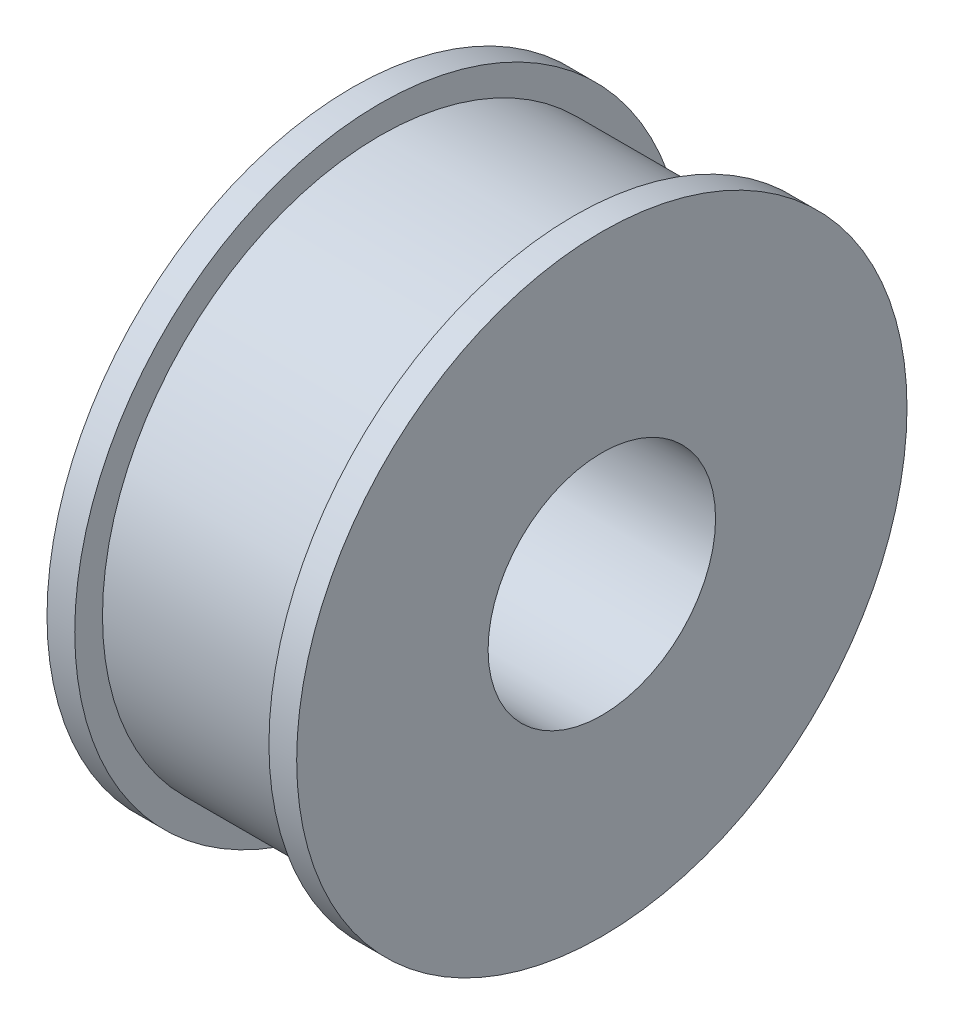
ISO-10303-21;
HEADER;
FILE_DESCRIPTION(('STEP AP214'),'2;1');
FILE_NAME('part.step','',(''),(''),'','','');
FILE_SCHEMA(('AUTOMOTIVE_DESIGN { 1 0 10303 214 1 1 1 1 }'));
ENDSEC;
DATA;
#1=APPLICATION_CONTEXT('core data for automotive mechanical design processes');
#2=APPLICATION_PROTOCOL_DEFINITION('international standard','automotive_design',2000,#1);
#3=PRODUCT_CONTEXT('',#1,'mechanical');
#4=PRODUCT('Part','Part','',(#3));
#5=PRODUCT_RELATED_PRODUCT_CATEGORY('part','',(#4));
#6=PRODUCT_DEFINITION_FORMATION('','',#4);
#7=PRODUCT_DEFINITION_CONTEXT('part definition',#1,'design');
#8=PRODUCT_DEFINITION('design','',#6,#7);
#9=PRODUCT_DEFINITION_SHAPE('','',#8);
#10=(LENGTH_UNIT() NAMED_UNIT(*) SI_UNIT(.MILLI.,.METRE.));
#11=(NAMED_UNIT(*) PLANE_ANGLE_UNIT() SI_UNIT($,.RADIAN.));
#12=(NAMED_UNIT(*) SI_UNIT($,.STERADIAN.) SOLID_ANGLE_UNIT());
#13=UNCERTAINTY_MEASURE_WITH_UNIT(LENGTH_MEASURE(1.E-05),#10,'distance_accuracy_value','');
#14=(GEOMETRIC_REPRESENTATION_CONTEXT(3) GLOBAL_UNCERTAINTY_ASSIGNED_CONTEXT((#13)) GLOBAL_UNIT_ASSIGNED_CONTEXT((#10,
#11,#12)) REPRESENTATION_CONTEXT('',''));
#15=CARTESIAN_POINT('',(0.,0.,0.));
#16=DIRECTION('',(0.,0.,1.));
#17=DIRECTION('',(1.,0.,0.));
#18=AXIS2_PLACEMENT_3D('',#15,#16,#17);
#19=CARTESIAN_POINT('',(0.,0.,0.));
#20=DIRECTION('',(-1.,0.,0.));
#21=DIRECTION('',(0.,0.,1.));
#22=AXIS2_PLACEMENT_3D('',#19,#20,#21);
#23=CYLINDRICAL_SURFACE('',#22,11.);
#24=CARTESIAN_POINT('',(-5.5,0.,0.));
#25=DIRECTION('',(-1.,0.,0.));
#26=DIRECTION('',(0.,0.,1.));
#27=AXIS2_PLACEMENT_3D('',#24,#25,#26);
#28=CIRCLE('',#27,11.);
#29=CARTESIAN_POINT('',(-5.5,0.,11.));
#30=VERTEX_POINT('',#29);
#31=EDGE_CURVE('E50',#30,#30,#28,.T.);
#32=ORIENTED_EDGE('',*,*,#31,.F.);
#33=EDGE_LOOP('',(#32));
#34=FACE_BOUND('',#33,.T.);
#35=CARTESIAN_POINT('',(-4.5,0.,0.));
#36=DIRECTION('',(-1.,0.,0.));
#37=DIRECTION('',(0.,0.,1.));
#38=AXIS2_PLACEMENT_3D('',#35,#36,#37);
#39=CIRCLE('',#38,11.);
#40=CARTESIAN_POINT('',(-4.5,0.,11.));
#41=VERTEX_POINT('',#40);
#42=EDGE_CURVE('E61',#41,#41,#39,.T.);
#43=ORIENTED_EDGE('',*,*,#42,.T.);
#44=EDGE_LOOP('',(#43));
#45=FACE_BOUND('',#44,.T.);
#46=ADVANCED_FACE('F37',(#34,#45),#23,.T.);
#47=CARTESIAN_POINT('',(3.5,0.,0.));
#48=DIRECTION('',(-1.,0.,0.));
#49=DIRECTION('',(0.,0.,1.));
#50=AXIS2_PLACEMENT_3D('',#47,#48,#49);
#51=CIRCLE('',#50,11.);
#52=CARTESIAN_POINT('',(3.5,0.,11.));
#53=VERTEX_POINT('',#52);
#54=EDGE_CURVE('E55',#53,#53,#51,.T.);
#55=ORIENTED_EDGE('',*,*,#54,.T.);
#56=EDGE_LOOP('',(#55));
#57=FACE_BOUND('',#56,.T.);
#58=CARTESIAN_POINT('',(2.5,0.,0.));
#59=DIRECTION('',(-1.,0.,0.));
#60=DIRECTION('',(0.,0.,1.));
#61=AXIS2_PLACEMENT_3D('',#58,#59,#60);
#62=CIRCLE('',#61,11.);
#63=CARTESIAN_POINT('',(2.5,0.,11.));
#64=VERTEX_POINT('',#63);
#65=EDGE_CURVE('E73',#64,#64,#62,.T.);
#66=ORIENTED_EDGE('',*,*,#65,.F.);
#67=EDGE_LOOP('',(#66));
#68=FACE_BOUND('',#67,.T.);
#69=ADVANCED_FACE('F81',(#57,#68),#23,.T.);
#70=CARTESIAN_POINT('',(3.5,4.1,0.));
#71=DIRECTION('',(-1.,0.,0.));
#72=DIRECTION('',(0.,0.,1.));
#73=AXIS2_PLACEMENT_3D('',#70,#71,#72);
#74=PLANE('',#73);
#75=ORIENTED_EDGE('',*,*,#54,.F.);
#76=EDGE_LOOP('',(#75));
#77=FACE_BOUND('',#76,.T.);
#78=CARTESIAN_POINT('',(3.5,0.,0.));
#79=DIRECTION('',(-1.,0.,0.));
#80=DIRECTION('',(0.,0.,1.));
#81=AXIS2_PLACEMENT_3D('',#78,#79,#80);
#82=CIRCLE('',#81,4.1);
#83=CARTESIAN_POINT('',(3.5,0.,4.1));
#84=VERTEX_POINT('',#83);
#85=EDGE_CURVE('E10',#84,#84,#82,.T.);
#86=ORIENTED_EDGE('',*,*,#85,.T.);
#87=EDGE_LOOP('',(#86));
#88=FACE_BOUND('',#87,.T.);
#89=ADVANCED_FACE('F39',(#77,#88),#74,.F.);
#90=CARTESIAN_POINT('',(0.,0.,0.));
#91=DIRECTION('',(-1.,0.,0.));
#92=DIRECTION('',(0.,0.,1.));
#93=AXIS2_PLACEMENT_3D('',#90,#91,#92);
#94=CYLINDRICAL_SURFACE('',#93,4.1);
#95=ORIENTED_EDGE('',*,*,#85,.F.);
#96=EDGE_LOOP('',(#95));
#97=FACE_BOUND('',#96,.T.);
#98=CARTESIAN_POINT('',(-5.5,0.,0.));
#99=DIRECTION('',(-1.,0.,0.));
#100=DIRECTION('',(0.,0.,1.));
#101=AXIS2_PLACEMENT_3D('',#98,#99,#100);
#102=CIRCLE('',#101,4.1);
#103=CARTESIAN_POINT('',(-5.5,0.,4.1));
#104=VERTEX_POINT('',#103);
#105=EDGE_CURVE('E45',#104,#104,#102,.T.);
#106=ORIENTED_EDGE('',*,*,#105,.T.);
#107=EDGE_LOOP('',(#106));
#108=FACE_BOUND('',#107,.T.);
#109=ADVANCED_FACE('F89',(#97,#108),#94,.F.);
#110=CARTESIAN_POINT('',(-5.5,11.,0.));
#111=DIRECTION('',(1.,0.,0.));
#112=DIRECTION('',(0.,0.,-1.));
#113=AXIS2_PLACEMENT_3D('',#110,#111,#112);
#114=PLANE('',#113);
#115=ORIENTED_EDGE('',*,*,#105,.F.);
#116=EDGE_LOOP('',(#115));
#117=FACE_BOUND('',#116,.T.);
#118=ORIENTED_EDGE('',*,*,#31,.T.);
#119=EDGE_LOOP('',(#118));
#120=FACE_BOUND('',#119,.T.);
#121=ADVANCED_FACE('F96',(#117,#120),#114,.F.);
#122=CARTESIAN_POINT('',(-4.5,11.,0.));
#123=DIRECTION('',(1.,0.,0.));
#124=DIRECTION('',(0.,0.,-1.));
#125=AXIS2_PLACEMENT_3D('',#122,#123,#124);
#126=PLANE('',#125);
#127=CARTESIAN_POINT('',(-4.5,0.,0.));
#128=DIRECTION('',(-1.,0.,0.));
#129=DIRECTION('',(0.,0.,1.));
#130=AXIS2_PLACEMENT_3D('',#127,#128,#129);
#131=CIRCLE('',#130,10.);
#132=CARTESIAN_POINT('',(-4.5,0.,10.));
#133=VERTEX_POINT('',#132);
#134=EDGE_CURVE('E65',#133,#133,#131,.T.);
#135=ORIENTED_EDGE('',*,*,#134,.T.);
#136=EDGE_LOOP('',(#135));
#137=FACE_BOUND('',#136,.T.);
#138=ORIENTED_EDGE('',*,*,#42,.F.);
#139=EDGE_LOOP('',(#138));
#140=FACE_BOUND('',#139,.T.);
#141=ADVANCED_FACE('F94',(#137,#140),#126,.T.);
#142=CARTESIAN_POINT('',(0.,0.,0.));
#143=DIRECTION('',(-1.,0.,0.));
#144=DIRECTION('',(0.,0.,1.));
#145=AXIS2_PLACEMENT_3D('',#142,#143,#144);
#146=CYLINDRICAL_SURFACE('',#145,10.);
#147=CARTESIAN_POINT('',(2.5,0.,0.));
#148=DIRECTION('',(-1.,0.,0.));
#149=DIRECTION('',(0.,0.,1.));
#150=AXIS2_PLACEMENT_3D('',#147,#148,#149);
#151=CIRCLE('',#150,10.);
#152=CARTESIAN_POINT('',(2.5,0.,10.));
#153=VERTEX_POINT('',#152);
#154=EDGE_CURVE('E69',#153,#153,#151,.T.);
#155=ORIENTED_EDGE('',*,*,#154,.T.);
#156=EDGE_LOOP('',(#155));
#157=FACE_BOUND('',#156,.T.);
#158=ORIENTED_EDGE('',*,*,#134,.F.);
#159=EDGE_LOOP('',(#158));
#160=FACE_BOUND('',#159,.T.);
#161=ADVANCED_FACE('F116',(#157,#160),#146,.T.);
#162=CARTESIAN_POINT('',(2.5,10.,0.));
#163=DIRECTION('',(-1.,0.,0.));
#164=DIRECTION('',(0.,0.,1.));
#165=AXIS2_PLACEMENT_3D('',#162,#163,#164);
#166=PLANE('',#165);
#167=ORIENTED_EDGE('',*,*,#65,.T.);
#168=EDGE_LOOP('',(#167));
#169=FACE_BOUND('',#168,.T.);
#170=ORIENTED_EDGE('',*,*,#154,.F.);
#171=EDGE_LOOP('',(#170));
#172=FACE_BOUND('',#171,.T.);
#173=ADVANCED_FACE('F78',(#169,#172),#166,.T.);
#174=CLOSED_SHELL('',(#46,#69,#89,#109,#121,#141,#161,#173));
#175=MANIFOLD_SOLID_BREP('B2',#174);
#176=ADVANCED_BREP_SHAPE_REPRESENTATION('',(#18,#175),#14);
#177=SHAPE_DEFINITION_REPRESENTATION(#9,#176);
ENDSEC;
END-ISO-10303-21;
